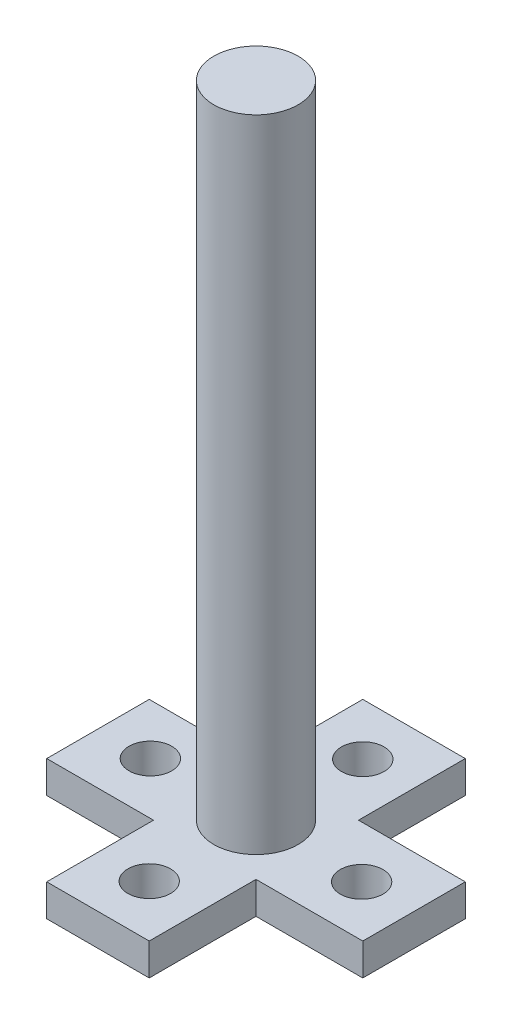
ISO-10303-21;
HEADER;
FILE_DESCRIPTION(('STEP AP214'),'2;1');
FILE_NAME('part.step','',(''),(''),'','','');
FILE_SCHEMA(('AUTOMOTIVE_DESIGN { 1 0 10303 214 1 1 1 1 }'));
ENDSEC;
DATA;
#1=APPLICATION_CONTEXT('core data for automotive mechanical design processes');
#2=APPLICATION_PROTOCOL_DEFINITION('international standard','automotive_design',2000,#1);
#3=PRODUCT_CONTEXT('',#1,'mechanical');
#4=PRODUCT('Part','Part','',(#3));
#5=PRODUCT_RELATED_PRODUCT_CATEGORY('part','',(#4));
#6=PRODUCT_DEFINITION_FORMATION('','',#4);
#7=PRODUCT_DEFINITION_CONTEXT('part definition',#1,'design');
#8=PRODUCT_DEFINITION('design','',#6,#7);
#9=PRODUCT_DEFINITION_SHAPE('','',#8);
#10=(LENGTH_UNIT() NAMED_UNIT(*) SI_UNIT(.MILLI.,.METRE.));
#11=(NAMED_UNIT(*) PLANE_ANGLE_UNIT() SI_UNIT($,.RADIAN.));
#12=(NAMED_UNIT(*) SI_UNIT($,.STERADIAN.) SOLID_ANGLE_UNIT());
#13=UNCERTAINTY_MEASURE_WITH_UNIT(LENGTH_MEASURE(1.E-05),#10,'distance_accuracy_value','');
#14=(GEOMETRIC_REPRESENTATION_CONTEXT(3) GLOBAL_UNCERTAINTY_ASSIGNED_CONTEXT((#13)) GLOBAL_UNIT_ASSIGNED_CONTEXT((#10,
#11,#12)) REPRESENTATION_CONTEXT('',''));
#15=CARTESIAN_POINT('',(0.,0.,0.));
#16=DIRECTION('',(0.,0.,1.));
#17=DIRECTION('',(1.,0.,0.));
#18=AXIS2_PLACEMENT_3D('',#15,#16,#17);
#19=CARTESIAN_POINT('',(0.,123.,0.));
#20=DIRECTION('',(0.,-1.,0.));
#21=DIRECTION('',(0.,0.,-1.));
#22=AXIS2_PLACEMENT_3D('',#19,#20,#21);
#23=CYLINDRICAL_SURFACE('',#22,3.95);
#24=CARTESIAN_POINT('',(0.,3.,0.));
#25=DIRECTION('',(0.,1.,0.));
#26=DIRECTION('',(0.,0.,1.));
#27=AXIS2_PLACEMENT_3D('',#24,#25,#26);
#28=CIRCLE('',#27,3.95);
#29=CARTESIAN_POINT('',(0.,3.,3.95));
#30=VERTEX_POINT('',#29);
#31=EDGE_CURVE('E188',#30,#30,#28,.T.);
#32=ORIENTED_EDGE('',*,*,#31,.T.);
#33=EDGE_LOOP('',(#32));
#34=FACE_BOUND('',#33,.T.);
#35=CARTESIAN_POINT('',(0.,63.,0.));
#36=DIRECTION('',(0.,1.,0.));
#37=DIRECTION('',(0.,0.,1.));
#38=AXIS2_PLACEMENT_3D('',#35,#36,#37);
#39=CIRCLE('',#38,3.95);
#40=CARTESIAN_POINT('',(0.,63.,3.95));
#41=VERTEX_POINT('',#40);
#42=EDGE_CURVE('E443',#41,#41,#39,.T.);
#43=ORIENTED_EDGE('',*,*,#42,.F.);
#44=EDGE_LOOP('',(#43));
#45=FACE_BOUND('',#44,.T.);
#46=ADVANCED_FACE('F46',(#34,#45),#23,.T.);
#47=CARTESIAN_POINT('',(-14.8,3.,0.));
#48=DIRECTION('',(-1.,0.,0.));
#49=DIRECTION('',(0.,0.,1.));
#50=AXIS2_PLACEMENT_3D('',#47,#48,#49);
#51=PLANE('',#50);
#52=DIRECTION('',(0.,0.,-1.));
#53=VECTOR('',#52,1.);
#54=CARTESIAN_POINT('',(-14.8,0.,0.));
#55=LINE('',#54,#53);
#56=CARTESIAN_POINT('',(-14.8,0.,4.8));
#57=VERTEX_POINT('',#56);
#58=CARTESIAN_POINT('',(-14.8,0.,-4.8));
#59=VERTEX_POINT('',#58);
#60=EDGE_CURVE('E187',#57,#59,#55,.T.);
#61=ORIENTED_EDGE('',*,*,#60,.F.);
#62=DIRECTION('',(0.,-1.,0.));
#63=VECTOR('',#62,1.);
#64=CARTESIAN_POINT('',(-14.8,3.,4.8));
#65=LINE('',#64,#63);
#66=CARTESIAN_POINT('',(-14.8,3.,4.8));
#67=VERTEX_POINT('',#66);
#68=EDGE_CURVE('E11',#67,#57,#65,.T.);
#69=ORIENTED_EDGE('',*,*,#68,.F.);
#70=DIRECTION('',(0.,0.,-1.));
#71=VECTOR('',#70,1.);
#72=CARTESIAN_POINT('',(-14.8,3.,0.));
#73=LINE('',#72,#71);
#74=CARTESIAN_POINT('',(-14.8,3.,-4.8));
#75=VERTEX_POINT('',#74);
#76=EDGE_CURVE('E300',#67,#75,#73,.T.);
#77=ORIENTED_EDGE('',*,*,#76,.T.);
#78=DIRECTION('',(0.,-1.,0.));
#79=VECTOR('',#78,1.);
#80=CARTESIAN_POINT('',(-14.8,3.,-4.8));
#81=LINE('',#80,#79);
#82=EDGE_CURVE('E64',#75,#59,#81,.T.);
#83=ORIENTED_EDGE('',*,*,#82,.T.);
#84=EDGE_LOOP('',(#61,#69,#77,#83));
#85=FACE_BOUND('',#84,.T.);
#86=ADVANCED_FACE('F336',(#85),#51,.T.);
#87=CARTESIAN_POINT('',(0.,3.,4.8));
#88=DIRECTION('',(0.,0.,-1.));
#89=DIRECTION('',(-1.,0.,0.));
#90=AXIS2_PLACEMENT_3D('',#87,#88,#89);
#91=PLANE('',#90);
#92=DIRECTION('',(1.,0.,0.));
#93=VECTOR('',#92,1.);
#94=CARTESIAN_POINT('',(0.,0.,4.8));
#95=LINE('',#94,#93);
#96=CARTESIAN_POINT('',(-4.80000000000001,0.,4.8));
#97=VERTEX_POINT('',#96);
#98=EDGE_CURVE('E191',#57,#97,#95,.T.);
#99=ORIENTED_EDGE('',*,*,#98,.T.);
#100=DIRECTION('',(0.,-1.,0.));
#101=VECTOR('',#100,1.);
#102=CARTESIAN_POINT('',(-4.80000000000001,3.,4.8));
#103=LINE('',#102,#101);
#104=CARTESIAN_POINT('',(-4.80000000000001,3.,4.8));
#105=VERTEX_POINT('',#104);
#106=EDGE_CURVE('E56',#105,#97,#103,.T.);
#107=ORIENTED_EDGE('',*,*,#106,.F.);
#108=DIRECTION('',(1.,0.,0.));
#109=VECTOR('',#108,1.);
#110=CARTESIAN_POINT('',(0.,3.,4.8));
#111=LINE('',#110,#109);
#112=EDGE_CURVE('E296',#67,#105,#111,.T.);
#113=ORIENTED_EDGE('',*,*,#112,.F.);
#114=ORIENTED_EDGE('',*,*,#68,.T.);
#115=EDGE_LOOP('',(#99,#107,#113,#114));
#116=FACE_BOUND('',#115,.T.);
#117=ADVANCED_FACE('F281',(#116),#91,.F.);
#118=CARTESIAN_POINT('',(-4.80000000000001,3.,0.));
#119=DIRECTION('',(-1.,0.,0.));
#120=DIRECTION('',(0.,0.,1.));
#121=AXIS2_PLACEMENT_3D('',#118,#119,#120);
#122=PLANE('',#121);
#123=DIRECTION('',(0.,0.,-1.));
#124=VECTOR('',#123,1.);
#125=CARTESIAN_POINT('',(-4.80000000000001,0.,0.));
#126=LINE('',#125,#124);
#127=CARTESIAN_POINT('',(-4.80000000000001,0.,14.8));
#128=VERTEX_POINT('',#127);
#129=EDGE_CURVE('E195',#128,#97,#126,.T.);
#130=ORIENTED_EDGE('',*,*,#129,.F.);
#131=DIRECTION('',(0.,-1.,0.));
#132=VECTOR('',#131,1.);
#133=CARTESIAN_POINT('',(-4.80000000000001,3.,14.8));
#134=LINE('',#133,#132);
#135=CARTESIAN_POINT('',(-4.80000000000001,3.,14.8));
#136=VERTEX_POINT('',#135);
#137=EDGE_CURVE('E269',#136,#128,#134,.T.);
#138=ORIENTED_EDGE('',*,*,#137,.F.);
#139=DIRECTION('',(0.,0.,-1.));
#140=VECTOR('',#139,1.);
#141=CARTESIAN_POINT('',(-4.80000000000001,3.,0.));
#142=LINE('',#141,#140);
#143=EDGE_CURVE('E278',#136,#105,#142,.T.);
#144=ORIENTED_EDGE('',*,*,#143,.T.);
#145=ORIENTED_EDGE('',*,*,#106,.T.);
#146=EDGE_LOOP('',(#130,#138,#144,#145));
#147=FACE_BOUND('',#146,.T.);
#148=ADVANCED_FACE('F276',(#147),#122,.T.);
#149=CARTESIAN_POINT('',(0.,3.,14.8));
#150=DIRECTION('',(0.,0.,-1.));
#151=DIRECTION('',(-1.,0.,0.));
#152=AXIS2_PLACEMENT_3D('',#149,#150,#151);
#153=PLANE('',#152);
#154=DIRECTION('',(1.,0.,0.));
#155=VECTOR('',#154,1.);
#156=CARTESIAN_POINT('',(0.,0.,14.8));
#157=LINE('',#156,#155);
#158=CARTESIAN_POINT('',(4.79999999999999,0.,14.8));
#159=VERTEX_POINT('',#158);
#160=EDGE_CURVE('E199',#128,#159,#157,.T.);
#161=ORIENTED_EDGE('',*,*,#160,.T.);
#162=DIRECTION('',(0.,-1.,0.));
#163=VECTOR('',#162,1.);
#164=CARTESIAN_POINT('',(4.79999999999999,3.,14.8));
#165=LINE('',#164,#163);
#166=CARTESIAN_POINT('',(4.79999999999999,3.,14.8));
#167=VERTEX_POINT('',#166);
#168=EDGE_CURVE('E265',#167,#159,#165,.T.);
#169=ORIENTED_EDGE('',*,*,#168,.F.);
#170=DIRECTION('',(1.,0.,0.));
#171=VECTOR('',#170,1.);
#172=CARTESIAN_POINT('',(0.,3.,14.8));
#173=LINE('',#172,#171);
#174=EDGE_CURVE('E291',#136,#167,#173,.T.);
#175=ORIENTED_EDGE('',*,*,#174,.F.);
#176=ORIENTED_EDGE('',*,*,#137,.T.);
#177=EDGE_LOOP('',(#161,#169,#175,#176));
#178=FACE_BOUND('',#177,.T.);
#179=ADVANCED_FACE('F288',(#178),#153,.F.);
#180=CARTESIAN_POINT('',(4.79999999999999,3.,0.));
#181=DIRECTION('',(-1.,0.,0.));
#182=DIRECTION('',(0.,0.,1.));
#183=AXIS2_PLACEMENT_3D('',#180,#181,#182);
#184=PLANE('',#183);
#185=DIRECTION('',(0.,0.,-1.));
#186=VECTOR('',#185,1.);
#187=CARTESIAN_POINT('',(4.79999999999999,0.,0.));
#188=LINE('',#187,#186);
#189=CARTESIAN_POINT('',(4.79999999999999,0.,4.8));
#190=VERTEX_POINT('',#189);
#191=EDGE_CURVE('E203',#159,#190,#188,.T.);
#192=ORIENTED_EDGE('',*,*,#191,.T.);
#193=DIRECTION('',(0.,-1.,0.));
#194=VECTOR('',#193,1.);
#195=CARTESIAN_POINT('',(4.79999999999999,3.,4.8));
#196=LINE('',#195,#194);
#197=CARTESIAN_POINT('',(4.79999999999999,3.,4.8));
#198=VERTEX_POINT('',#197);
#199=EDGE_CURVE('E261',#198,#190,#196,.T.);
#200=ORIENTED_EDGE('',*,*,#199,.F.);
#201=DIRECTION('',(0.,0.,-1.));
#202=VECTOR('',#201,1.);
#203=CARTESIAN_POINT('',(4.79999999999999,3.,0.));
#204=LINE('',#203,#202);
#205=EDGE_CURVE('E294',#167,#198,#204,.T.);
#206=ORIENTED_EDGE('',*,*,#205,.F.);
#207=ORIENTED_EDGE('',*,*,#168,.T.);
#208=EDGE_LOOP('',(#192,#200,#206,#207));
#209=FACE_BOUND('',#208,.T.);
#210=ADVANCED_FACE('F491',(#209),#184,.F.);
#211=CARTESIAN_POINT('',(0.,3.,4.8));
#212=DIRECTION('',(0.,0.,-1.));
#213=DIRECTION('',(-1.,0.,0.));
#214=AXIS2_PLACEMENT_3D('',#211,#212,#213);
#215=PLANE('',#214);
#216=DIRECTION('',(1.,0.,0.));
#217=VECTOR('',#216,1.);
#218=CARTESIAN_POINT('',(0.,0.,4.8));
#219=LINE('',#218,#217);
#220=CARTESIAN_POINT('',(14.8,0.,4.8));
#221=VERTEX_POINT('',#220);
#222=EDGE_CURVE('E207',#190,#221,#219,.T.);
#223=ORIENTED_EDGE('',*,*,#222,.T.);
#224=DIRECTION('',(0.,-1.,0.));
#225=VECTOR('',#224,1.);
#226=CARTESIAN_POINT('',(14.8,3.,4.8));
#227=LINE('',#226,#225);
#228=CARTESIAN_POINT('',(14.8,3.,4.8));
#229=VERTEX_POINT('',#228);
#230=EDGE_CURVE('E257',#229,#221,#227,.T.);
#231=ORIENTED_EDGE('',*,*,#230,.F.);
#232=DIRECTION('',(1.,0.,0.));
#233=VECTOR('',#232,1.);
#234=CARTESIAN_POINT('',(0.,3.,4.8));
#235=LINE('',#234,#233);
#236=EDGE_CURVE('E306',#198,#229,#235,.T.);
#237=ORIENTED_EDGE('',*,*,#236,.F.);
#238=ORIENTED_EDGE('',*,*,#199,.T.);
#239=EDGE_LOOP('',(#223,#231,#237,#238));
#240=FACE_BOUND('',#239,.T.);
#241=ADVANCED_FACE('F483',(#240),#215,.F.);
#242=CARTESIAN_POINT('',(14.8,3.,0.));
#243=DIRECTION('',(-1.,0.,0.));
#244=DIRECTION('',(0.,0.,1.));
#245=AXIS2_PLACEMENT_3D('',#242,#243,#244);
#246=PLANE('',#245);
#247=DIRECTION('',(0.,0.,-1.));
#248=VECTOR('',#247,1.);
#249=CARTESIAN_POINT('',(14.8,0.,0.));
#250=LINE('',#249,#248);
#251=CARTESIAN_POINT('',(14.8,0.,-4.8));
#252=VERTEX_POINT('',#251);
#253=EDGE_CURVE('E211',#221,#252,#250,.T.);
#254=ORIENTED_EDGE('',*,*,#253,.T.);
#255=DIRECTION('',(0.,-1.,0.));
#256=VECTOR('',#255,1.);
#257=CARTESIAN_POINT('',(14.8,3.,-4.8));
#258=LINE('',#257,#256);
#259=CARTESIAN_POINT('',(14.8,3.,-4.8));
#260=VERTEX_POINT('',#259);
#261=EDGE_CURVE('E254',#260,#252,#258,.T.);
#262=ORIENTED_EDGE('',*,*,#261,.F.);
#263=DIRECTION('',(0.,0.,-1.));
#264=VECTOR('',#263,1.);
#265=CARTESIAN_POINT('',(14.8,3.,0.));
#266=LINE('',#265,#264);
#267=EDGE_CURVE('E310',#229,#260,#266,.T.);
#268=ORIENTED_EDGE('',*,*,#267,.F.);
#269=ORIENTED_EDGE('',*,*,#230,.T.);
#270=EDGE_LOOP('',(#254,#262,#268,#269));
#271=FACE_BOUND('',#270,.T.);
#272=ADVANCED_FACE('F323',(#271),#246,.F.);
#273=CARTESIAN_POINT('',(0.,3.,-4.8));
#274=DIRECTION('',(0.,0.,-1.));
#275=DIRECTION('',(-1.,0.,0.));
#276=AXIS2_PLACEMENT_3D('',#273,#274,#275);
#277=PLANE('',#276);
#278=DIRECTION('',(1.,0.,0.));
#279=VECTOR('',#278,1.);
#280=CARTESIAN_POINT('',(0.,0.,-4.8));
#281=LINE('',#280,#279);
#282=CARTESIAN_POINT('',(4.79999999999999,0.,-4.8));
#283=VERTEX_POINT('',#282);
#284=EDGE_CURVE('E215',#283,#252,#281,.T.);
#285=ORIENTED_EDGE('',*,*,#284,.F.);
#286=DIRECTION('',(0.,-1.,0.));
#287=VECTOR('',#286,1.);
#288=CARTESIAN_POINT('',(4.79999999999999,3.,-4.8));
#289=LINE('',#288,#287);
#290=CARTESIAN_POINT('',(4.79999999999999,3.,-4.8));
#291=VERTEX_POINT('',#290);
#292=EDGE_CURVE('E251',#291,#283,#289,.T.);
#293=ORIENTED_EDGE('',*,*,#292,.F.);
#294=DIRECTION('',(1.,0.,0.));
#295=VECTOR('',#294,1.);
#296=CARTESIAN_POINT('',(0.,3.,-4.8));
#297=LINE('',#296,#295);
#298=EDGE_CURVE('E313',#291,#260,#297,.T.);
#299=ORIENTED_EDGE('',*,*,#298,.T.);
#300=ORIENTED_EDGE('',*,*,#261,.T.);
#301=EDGE_LOOP('',(#285,#293,#299,#300));
#302=FACE_BOUND('',#301,.T.);
#303=ADVANCED_FACE('F319',(#302),#277,.T.);
#304=CARTESIAN_POINT('',(4.79999999999999,3.,0.));
#305=DIRECTION('',(-1.,0.,0.));
#306=DIRECTION('',(0.,0.,1.));
#307=AXIS2_PLACEMENT_3D('',#304,#305,#306);
#308=PLANE('',#307);
#309=DIRECTION('',(0.,0.,-1.));
#310=VECTOR('',#309,1.);
#311=CARTESIAN_POINT('',(4.79999999999999,0.,0.));
#312=LINE('',#311,#310);
#313=CARTESIAN_POINT('',(4.79999999999999,0.,-14.8));
#314=VERTEX_POINT('',#313);
#315=EDGE_CURVE('E219',#283,#314,#312,.T.);
#316=ORIENTED_EDGE('',*,*,#315,.T.);
#317=DIRECTION('',(0.,-1.,0.));
#318=VECTOR('',#317,1.);
#319=CARTESIAN_POINT('',(4.79999999999999,3.,-14.8));
#320=LINE('',#319,#318);
#321=CARTESIAN_POINT('',(4.79999999999999,3.,-14.8));
#322=VERTEX_POINT('',#321);
#323=EDGE_CURVE('E148',#322,#314,#320,.T.);
#324=ORIENTED_EDGE('',*,*,#323,.F.);
#325=DIRECTION('',(0.,0.,-1.));
#326=VECTOR('',#325,1.);
#327=CARTESIAN_POINT('',(4.79999999999999,3.,0.));
#328=LINE('',#327,#326);
#329=EDGE_CURVE('E159',#291,#322,#328,.T.);
#330=ORIENTED_EDGE('',*,*,#329,.F.);
#331=ORIENTED_EDGE('',*,*,#292,.T.);
#332=EDGE_LOOP('',(#316,#324,#330,#331));
#333=FACE_BOUND('',#332,.T.);
#334=ADVANCED_FACE('F326',(#333),#308,.F.);
#335=CARTESIAN_POINT('',(0.,3.,-14.8));
#336=DIRECTION('',(0.,0.,-1.));
#337=DIRECTION('',(-1.,0.,0.));
#338=AXIS2_PLACEMENT_3D('',#335,#336,#337);
#339=PLANE('',#338);
#340=DIRECTION('',(1.,0.,0.));
#341=VECTOR('',#340,1.);
#342=CARTESIAN_POINT('',(0.,0.,-14.8));
#343=LINE('',#342,#341);
#344=CARTESIAN_POINT('',(-4.80000000000001,0.,-14.8));
#345=VERTEX_POINT('',#344);
#346=EDGE_CURVE('E143',#345,#314,#343,.T.);
#347=ORIENTED_EDGE('',*,*,#346,.F.);
#348=DIRECTION('',(0.,-1.,0.));
#349=VECTOR('',#348,1.);
#350=CARTESIAN_POINT('',(-4.80000000000001,3.,-14.8));
#351=LINE('',#350,#349);
#352=CARTESIAN_POINT('',(-4.80000000000001,3.,-14.8));
#353=VERTEX_POINT('',#352);
#354=EDGE_CURVE('E138',#353,#345,#351,.T.);
#355=ORIENTED_EDGE('',*,*,#354,.F.);
#356=DIRECTION('',(1.,0.,0.));
#357=VECTOR('',#356,1.);
#358=CARTESIAN_POINT('',(0.,3.,-14.8));
#359=LINE('',#358,#357);
#360=EDGE_CURVE('E141',#353,#322,#359,.T.);
#361=ORIENTED_EDGE('',*,*,#360,.T.);
#362=ORIENTED_EDGE('',*,*,#323,.T.);
#363=EDGE_LOOP('',(#347,#355,#361,#362));
#364=FACE_BOUND('',#363,.T.);
#365=ADVANCED_FACE('F140',(#364),#339,.T.);
#366=CARTESIAN_POINT('',(-4.80000000000001,3.,0.));
#367=DIRECTION('',(-1.,0.,0.));
#368=DIRECTION('',(0.,0.,1.));
#369=AXIS2_PLACEMENT_3D('',#366,#367,#368);
#370=PLANE('',#369);
#371=DIRECTION('',(0.,0.,-1.));
#372=VECTOR('',#371,1.);
#373=CARTESIAN_POINT('',(-4.80000000000001,0.,0.));
#374=LINE('',#373,#372);
#375=CARTESIAN_POINT('',(-4.80000000000001,0.,-4.8));
#376=VERTEX_POINT('',#375);
#377=EDGE_CURVE('E225',#376,#345,#374,.T.);
#378=ORIENTED_EDGE('',*,*,#377,.F.);
#379=DIRECTION('',(0.,-1.,0.));
#380=VECTOR('',#379,1.);
#381=CARTESIAN_POINT('',(-4.80000000000001,3.,-4.8));
#382=LINE('',#381,#380);
#383=CARTESIAN_POINT('',(-4.80000000000001,3.,-4.8));
#384=VERTEX_POINT('',#383);
#385=EDGE_CURVE('E101',#384,#376,#382,.T.);
#386=ORIENTED_EDGE('',*,*,#385,.F.);
#387=DIRECTION('',(0.,0.,-1.));
#388=VECTOR('',#387,1.);
#389=CARTESIAN_POINT('',(-4.80000000000001,3.,0.));
#390=LINE('',#389,#388);
#391=EDGE_CURVE('E156',#384,#353,#390,.T.);
#392=ORIENTED_EDGE('',*,*,#391,.T.);
#393=ORIENTED_EDGE('',*,*,#354,.T.);
#394=EDGE_LOOP('',(#378,#386,#392,#393));
#395=FACE_BOUND('',#394,.T.);
#396=ADVANCED_FACE('F163',(#395),#370,.T.);
#397=CARTESIAN_POINT('',(9.94644047395354,3.,0.0535595260516415));
#398=DIRECTION('',(0.,-1.,0.));
#399=DIRECTION('',(0.,0.,-1.));
#400=AXIS2_PLACEMENT_3D('',#397,#398,#399);
#401=CYLINDRICAL_SURFACE('',#400,2.);
#402=CARTESIAN_POINT('',(9.94644047395354,3.,0.0535595260516415));
#403=DIRECTION('',(0.,1.,0.));
#404=DIRECTION('',(0.,0.,1.));
#405=AXIS2_PLACEMENT_3D('',#402,#403,#404);
#406=CIRCLE('',#405,2.);
#407=CARTESIAN_POINT('',(9.94644047395354,3.,2.05355952605164));
#408=VERTEX_POINT('',#407);
#409=EDGE_CURVE('E175',#408,#408,#406,.T.);
#410=ORIENTED_EDGE('',*,*,#409,.T.);
#411=EDGE_LOOP('',(#410));
#412=FACE_BOUND('',#411,.T.);
#413=CARTESIAN_POINT('',(9.94644047395354,0.,0.0535595260516415));
#414=DIRECTION('',(0.,1.,0.));
#415=DIRECTION('',(0.,0.,1.));
#416=AXIS2_PLACEMENT_3D('',#413,#414,#415);
#417=CIRCLE('',#416,2.);
#418=CARTESIAN_POINT('',(9.94644047395354,0.,2.05355952605164));
#419=VERTEX_POINT('',#418);
#420=EDGE_CURVE('E236',#419,#419,#417,.T.);
#421=ORIENTED_EDGE('',*,*,#420,.F.);
#422=EDGE_LOOP('',(#421));
#423=FACE_BOUND('',#422,.T.);
#424=ADVANCED_FACE('F358',(#412,#423),#401,.F.);
#425=CARTESIAN_POINT('',(0.0535595260516067,3.,-9.94644047395354));
#426=DIRECTION('',(0.,-1.,0.));
#427=DIRECTION('',(0.,0.,-1.));
#428=AXIS2_PLACEMENT_3D('',#425,#426,#427);
#429=CYLINDRICAL_SURFACE('',#428,2.);
#430=CARTESIAN_POINT('',(0.0535595260516067,3.,-9.94644047395354));
#431=DIRECTION('',(0.,1.,0.));
#432=DIRECTION('',(0.,0.,1.));
#433=AXIS2_PLACEMENT_3D('',#430,#431,#432);
#434=CIRCLE('',#433,2.);
#435=CARTESIAN_POINT('',(0.0535595260516067,3.,-7.94644047395355));
#436=VERTEX_POINT('',#435);
#437=EDGE_CURVE('E168',#436,#436,#434,.T.);
#438=ORIENTED_EDGE('',*,*,#437,.T.);
#439=EDGE_LOOP('',(#438));
#440=FACE_BOUND('',#439,.T.);
#441=CARTESIAN_POINT('',(0.0535595260516067,0.,-9.94644047395354));
#442=DIRECTION('',(0.,1.,0.));
#443=DIRECTION('',(0.,0.,1.));
#444=AXIS2_PLACEMENT_3D('',#441,#442,#443);
#445=CIRCLE('',#444,2.);
#446=CARTESIAN_POINT('',(0.0535595260516067,0.,-7.94644047395355));
#447=VERTEX_POINT('',#446);
#448=EDGE_CURVE('E232',#447,#447,#445,.T.);
#449=ORIENTED_EDGE('',*,*,#448,.F.);
#450=EDGE_LOOP('',(#449));
#451=FACE_BOUND('',#450,.T.);
#452=ADVANCED_FACE('F361',(#440,#451),#429,.F.);
#453=CARTESIAN_POINT('',(0.,3.,-4.8));
#454=DIRECTION('',(0.,0.,-1.));
#455=DIRECTION('',(-1.,0.,0.));
#456=AXIS2_PLACEMENT_3D('',#453,#454,#455);
#457=PLANE('',#456);
#458=DIRECTION('',(1.,0.,0.));
#459=VECTOR('',#458,1.);
#460=CARTESIAN_POINT('',(0.,0.,-4.8));
#461=LINE('',#460,#459);
#462=EDGE_CURVE('E228',#59,#376,#461,.T.);
#463=ORIENTED_EDGE('',*,*,#462,.F.);
#464=ORIENTED_EDGE('',*,*,#82,.F.);
#465=DIRECTION('',(1.,0.,0.));
#466=VECTOR('',#465,1.);
#467=CARTESIAN_POINT('',(0.,3.,-4.8));
#468=LINE('',#467,#466);
#469=EDGE_CURVE('E165',#75,#384,#468,.T.);
#470=ORIENTED_EDGE('',*,*,#469,.T.);
#471=ORIENTED_EDGE('',*,*,#385,.T.);
#472=EDGE_LOOP('',(#463,#464,#470,#471));
#473=FACE_BOUND('',#472,.T.);
#474=ADVANCED_FACE('F365',(#473),#457,.T.);
#475=CARTESIAN_POINT('',(-9.94644047395354,3.,-0.053559526051572));
#476=DIRECTION('',(0.,-1.,0.));
#477=DIRECTION('',(0.,0.,-1.));
#478=AXIS2_PLACEMENT_3D('',#475,#476,#477);
#479=CYLINDRICAL_SURFACE('',#478,2.);
#480=CARTESIAN_POINT('',(-9.94644047395354,3.,-0.053559526051572));
#481=DIRECTION('',(0.,1.,0.));
#482=DIRECTION('',(0.,0.,1.));
#483=AXIS2_PLACEMENT_3D('',#480,#481,#482);
#484=CIRCLE('',#483,2.);
#485=CARTESIAN_POINT('',(-9.94644047395354,3.,1.94644047394843));
#486=VERTEX_POINT('',#485);
#487=EDGE_CURVE('E244',#486,#486,#484,.T.);
#488=ORIENTED_EDGE('',*,*,#487,.T.);
#489=EDGE_LOOP('',(#488));
#490=FACE_BOUND('',#489,.T.);
#491=CARTESIAN_POINT('',(-9.94644047395354,0.,-0.053559526051572));
#492=DIRECTION('',(0.,1.,0.));
#493=DIRECTION('',(0.,0.,1.));
#494=AXIS2_PLACEMENT_3D('',#491,#492,#493);
#495=CIRCLE('',#494,2.);
#496=CARTESIAN_POINT('',(-9.94644047395354,0.,1.94644047394843));
#497=VERTEX_POINT('',#496);
#498=EDGE_CURVE('E183',#497,#497,#495,.T.);
#499=ORIENTED_EDGE('',*,*,#498,.F.);
#500=EDGE_LOOP('',(#499));
#501=FACE_BOUND('',#500,.T.);
#502=ADVANCED_FACE('F48',(#490,#501),#479,.F.);
#503=CARTESIAN_POINT('',(-0.0535595260516762,3.,9.94644047395354));
#504=DIRECTION('',(0.,-1.,0.));
#505=DIRECTION('',(0.,0.,-1.));
#506=AXIS2_PLACEMENT_3D('',#503,#504,#505);
#507=CYLINDRICAL_SURFACE('',#506,2.);
#508=CARTESIAN_POINT('',(-0.0535595260516762,3.,9.94644047395354));
#509=DIRECTION('',(0.,1.,0.));
#510=DIRECTION('',(0.,0.,1.));
#511=AXIS2_PLACEMENT_3D('',#508,#509,#510);
#512=CIRCLE('',#511,2.);
#513=CARTESIAN_POINT('',(-0.0535595260516762,3.,11.9464404739535));
#514=VERTEX_POINT('',#513);
#515=EDGE_CURVE('E179',#514,#514,#512,.T.);
#516=ORIENTED_EDGE('',*,*,#515,.T.);
#517=EDGE_LOOP('',(#516));
#518=FACE_BOUND('',#517,.T.);
#519=CARTESIAN_POINT('',(-0.0535595260516762,0.,9.94644047395354));
#520=DIRECTION('',(0.,1.,0.));
#521=DIRECTION('',(0.,0.,1.));
#522=AXIS2_PLACEMENT_3D('',#519,#520,#521);
#523=CIRCLE('',#522,2.);
#524=CARTESIAN_POINT('',(-0.0535595260516762,0.,11.9464404739535));
#525=VERTEX_POINT('',#524);
#526=EDGE_CURVE('E240',#525,#525,#523,.T.);
#527=ORIENTED_EDGE('',*,*,#526,.F.);
#528=EDGE_LOOP('',(#527));
#529=FACE_BOUND('',#528,.T.);
#530=ADVANCED_FACE('F350',(#518,#529),#507,.F.);
#531=CARTESIAN_POINT('',(0.,3.,0.));
#532=DIRECTION('',(0.,1.,0.));
#533=DIRECTION('',(0.,0.,1.));
#534=AXIS2_PLACEMENT_3D('',#531,#532,#533);
#535=PLANE('',#534);
#536=ORIENTED_EDGE('',*,*,#31,.F.);
#537=EDGE_LOOP('',(#536));
#538=FACE_BOUND('',#537,.T.);
#539=ORIENTED_EDGE('',*,*,#487,.F.);
#540=EDGE_LOOP('',(#539));
#541=FACE_BOUND('',#540,.T.);
#542=ORIENTED_EDGE('',*,*,#76,.F.);
#543=ORIENTED_EDGE('',*,*,#112,.T.);
#544=ORIENTED_EDGE('',*,*,#143,.F.);
#545=ORIENTED_EDGE('',*,*,#174,.T.);
#546=ORIENTED_EDGE('',*,*,#205,.T.);
#547=ORIENTED_EDGE('',*,*,#236,.T.);
#548=ORIENTED_EDGE('',*,*,#267,.T.);
#549=ORIENTED_EDGE('',*,*,#298,.F.);
#550=ORIENTED_EDGE('',*,*,#329,.T.);
#551=ORIENTED_EDGE('',*,*,#360,.F.);
#552=ORIENTED_EDGE('',*,*,#391,.F.);
#553=ORIENTED_EDGE('',*,*,#469,.F.);
#554=EDGE_LOOP('',(#542,#543,#544,#545,#546,#547,#548,#549,#550,#551,#552,#553));
#555=FACE_BOUND('',#554,.T.);
#556=ORIENTED_EDGE('',*,*,#437,.F.);
#557=EDGE_LOOP('',(#556));
#558=FACE_BOUND('',#557,.T.);
#559=ORIENTED_EDGE('',*,*,#409,.F.);
#560=EDGE_LOOP('',(#559));
#561=FACE_BOUND('',#560,.T.);
#562=ORIENTED_EDGE('',*,*,#515,.F.);
#563=EDGE_LOOP('',(#562));
#564=FACE_BOUND('',#563,.T.);
#565=ADVANCED_FACE('F153',(#538,#541,#555,#558,#561,#564),#535,.T.);
#566=CARTESIAN_POINT('',(0.,0.,0.));
#567=DIRECTION('',(0.,1.,0.));
#568=DIRECTION('',(0.,0.,1.));
#569=AXIS2_PLACEMENT_3D('',#566,#567,#568);
#570=PLANE('',#569);
#571=ORIENTED_EDGE('',*,*,#498,.T.);
#572=EDGE_LOOP('',(#571));
#573=FACE_BOUND('',#572,.T.);
#574=ORIENTED_EDGE('',*,*,#60,.T.);
#575=ORIENTED_EDGE('',*,*,#462,.T.);
#576=ORIENTED_EDGE('',*,*,#377,.T.);
#577=ORIENTED_EDGE('',*,*,#346,.T.);
#578=ORIENTED_EDGE('',*,*,#315,.F.);
#579=ORIENTED_EDGE('',*,*,#284,.T.);
#580=ORIENTED_EDGE('',*,*,#253,.F.);
#581=ORIENTED_EDGE('',*,*,#222,.F.);
#582=ORIENTED_EDGE('',*,*,#191,.F.);
#583=ORIENTED_EDGE('',*,*,#160,.F.);
#584=ORIENTED_EDGE('',*,*,#129,.T.);
#585=ORIENTED_EDGE('',*,*,#98,.F.);
#586=EDGE_LOOP('',(#574,#575,#576,#577,#578,#579,#580,#581,#582,#583,#584,#585));
#587=FACE_BOUND('',#586,.T.);
#588=ORIENTED_EDGE('',*,*,#448,.T.);
#589=EDGE_LOOP('',(#588));
#590=FACE_BOUND('',#589,.T.);
#591=ORIENTED_EDGE('',*,*,#420,.T.);
#592=EDGE_LOOP('',(#591));
#593=FACE_BOUND('',#592,.T.);
#594=ORIENTED_EDGE('',*,*,#526,.T.);
#595=EDGE_LOOP('',(#594));
#596=FACE_BOUND('',#595,.T.);
#597=ADVANCED_FACE('F284',(#573,#587,#590,#593,#596),#570,.F.);
#598=CARTESIAN_POINT('',(0.,63.,0.));
#599=DIRECTION('',(0.,1.,0.));
#600=DIRECTION('',(0.,0.,1.));
#601=AXIS2_PLACEMENT_3D('',#598,#599,#600);
#602=PLANE('',#601);
#603=ORIENTED_EDGE('',*,*,#42,.T.);
#604=EDGE_LOOP('',(#603));
#605=FACE_BOUND('',#604,.T.);
#606=ADVANCED_FACE('F348',(#605),#602,.T.);
#607=CLOSED_SHELL('',(#46,#86,#117,#148,#179,#210,#241,#272,#303,#334,#365,#396,#424,#452,#474,
#502,#530,#565,#597,#606));
#608=MANIFOLD_SOLID_BREP('B2',#607);
#609=ADVANCED_BREP_SHAPE_REPRESENTATION('',(#18,#608),#14);
#610=SHAPE_DEFINITION_REPRESENTATION(#9,#609);
ENDSEC;
END-ISO-10303-21;
